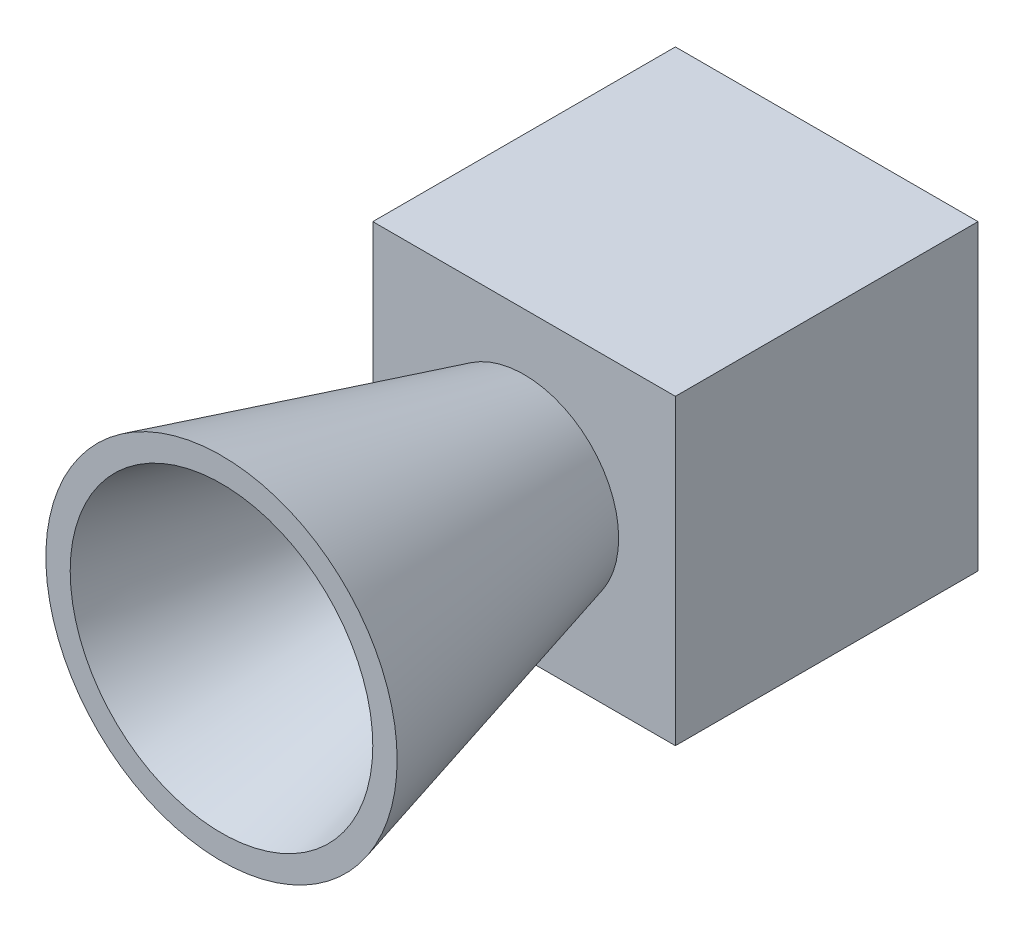
ISO-10303-21;
HEADER;
FILE_DESCRIPTION(('STEP AP214'),'2;1');
FILE_NAME('part.step','',(''),(''),'','','');
FILE_SCHEMA(('AUTOMOTIVE_DESIGN { 1 0 10303 214 1 1 1 1 }'));
ENDSEC;
DATA;
#1=APPLICATION_CONTEXT('core data for automotive mechanical design processes');
#2=APPLICATION_PROTOCOL_DEFINITION('international standard','automotive_design',2000,#1);
#3=PRODUCT_CONTEXT('',#1,'mechanical');
#4=PRODUCT('Part','Part','',(#3));
#5=PRODUCT_RELATED_PRODUCT_CATEGORY('part','',(#4));
#6=PRODUCT_DEFINITION_FORMATION('','',#4);
#7=PRODUCT_DEFINITION_CONTEXT('part definition',#1,'design');
#8=PRODUCT_DEFINITION('design','',#6,#7);
#9=PRODUCT_DEFINITION_SHAPE('','',#8);
#10=(LENGTH_UNIT() NAMED_UNIT(*) SI_UNIT(.MILLI.,.METRE.));
#11=(NAMED_UNIT(*) PLANE_ANGLE_UNIT() SI_UNIT($,.RADIAN.));
#12=(NAMED_UNIT(*) SI_UNIT($,.STERADIAN.) SOLID_ANGLE_UNIT());
#13=UNCERTAINTY_MEASURE_WITH_UNIT(LENGTH_MEASURE(1.E-05),#10,'distance_accuracy_value','');
#14=(GEOMETRIC_REPRESENTATION_CONTEXT(3) GLOBAL_UNCERTAINTY_ASSIGNED_CONTEXT((#13)) GLOBAL_UNIT_ASSIGNED_CONTEXT((#10,
#11,#12)) REPRESENTATION_CONTEXT('',''));
#15=CARTESIAN_POINT('',(0.,0.,0.));
#16=DIRECTION('',(0.,0.,1.));
#17=DIRECTION('',(1.,0.,0.));
#18=AXIS2_PLACEMENT_3D('',#15,#16,#17);
#19=CARTESIAN_POINT('',(0.,0.,1219.2));
#20=DIRECTION('',(0.,0.,1.));
#21=DIRECTION('',(1.,0.,0.));
#22=AXIS2_PLACEMENT_3D('',#19,#20,#21);
#23=PLANE('',#22);
#24=DIRECTION('',(0.,-1.,0.));
#25=VECTOR('',#24,1.);
#26=CARTESIAN_POINT('',(-609.6,-609.6,1219.2));
#27=LINE('',#26,#25);
#28=CARTESIAN_POINT('',(-609.6,609.6,1219.2));
#29=VERTEX_POINT('',#28);
#30=CARTESIAN_POINT('',(-609.6,-609.6,1219.2));
#31=VERTEX_POINT('',#30);
#32=EDGE_CURVE('E168',#29,#31,#27,.T.);
#33=ORIENTED_EDGE('',*,*,#32,.T.);
#34=DIRECTION('',(1.,0.,0.));
#35=VECTOR('',#34,1.);
#36=CARTESIAN_POINT('',(609.6,-609.6,1219.2));
#37=LINE('',#36,#35);
#38=CARTESIAN_POINT('',(609.6,-609.6,1219.2));
#39=VERTEX_POINT('',#38);
#40=EDGE_CURVE('E86',#31,#39,#37,.T.);
#41=ORIENTED_EDGE('',*,*,#40,.T.);
#42=DIRECTION('',(0.,1.,0.));
#43=VECTOR('',#42,1.);
#44=CARTESIAN_POINT('',(609.6,-609.6,1219.2));
#45=LINE('',#44,#43);
#46=CARTESIAN_POINT('',(609.6,609.6,1219.2));
#47=VERTEX_POINT('',#46);
#48=EDGE_CURVE('E171',#39,#47,#45,.T.);
#49=ORIENTED_EDGE('',*,*,#48,.T.);
#50=DIRECTION('',(-1.,0.,0.));
#51=VECTOR('',#50,1.);
#52=CARTESIAN_POINT('',(609.6,609.6,1219.2));
#53=LINE('',#52,#51);
#54=EDGE_CURVE('E55',#47,#29,#53,.T.);
#55=ORIENTED_EDGE('',*,*,#54,.T.);
#56=EDGE_LOOP('',(#33,#41,#49,#55));
#57=FACE_BOUND('',#56,.T.);
#58=CARTESIAN_POINT('',(0.,0.,1219.2));
#59=DIRECTION('',(0.,0.,1.));
#60=DIRECTION('',(1.,0.,0.));
#61=AXIS2_PLACEMENT_3D('',#58,#59,#60);
#62=CIRCLE('',#61,381.);
#63=CARTESIAN_POINT('',(381.,0.,1219.2));
#64=VERTEX_POINT('',#63);
#65=EDGE_CURVE('E161',#64,#64,#62,.T.);
#66=ORIENTED_EDGE('',*,*,#65,.F.);
#67=EDGE_LOOP('',(#66));
#68=FACE_BOUND('',#67,.T.);
#69=ADVANCED_FACE('F38',(#57,#68),#23,.T.);
#70=CARTESIAN_POINT('',(-609.6,-609.6,1219.2));
#71=DIRECTION('',(1.,0.,0.));
#72=DIRECTION('',(0.,0.,-1.));
#73=AXIS2_PLACEMENT_3D('',#70,#71,#72);
#74=PLANE('',#73);
#75=DIRECTION('',(0.,-1.,0.));
#76=VECTOR('',#75,1.);
#77=CARTESIAN_POINT('',(-609.6,-609.6,0.));
#78=LINE('',#77,#76);
#79=CARTESIAN_POINT('',(-609.6,609.6,0.));
#80=VERTEX_POINT('',#79);
#81=CARTESIAN_POINT('',(-609.6,-609.6,0.));
#82=VERTEX_POINT('',#81);
#83=EDGE_CURVE('E167',#80,#82,#78,.T.);
#84=ORIENTED_EDGE('',*,*,#83,.T.);
#85=DIRECTION('',(0.,0.,-1.));
#86=VECTOR('',#85,1.);
#87=CARTESIAN_POINT('',(-609.6,-609.6,1219.2));
#88=LINE('',#87,#86);
#89=EDGE_CURVE('E11',#31,#82,#88,.T.);
#90=ORIENTED_EDGE('',*,*,#89,.F.);
#91=ORIENTED_EDGE('',*,*,#32,.F.);
#92=DIRECTION('',(0.,0.,-1.));
#93=VECTOR('',#92,1.);
#94=CARTESIAN_POINT('',(-609.6,609.6,1219.2));
#95=LINE('',#94,#93);
#96=EDGE_CURVE('E174',#29,#80,#95,.T.);
#97=ORIENTED_EDGE('',*,*,#96,.T.);
#98=EDGE_LOOP('',(#84,#90,#91,#97));
#99=FACE_BOUND('',#98,.T.);
#100=ADVANCED_FACE('F40',(#99),#74,.F.);
#101=CARTESIAN_POINT('',(609.6,-609.6,1219.2));
#102=DIRECTION('',(0.,1.,0.));
#103=DIRECTION('',(-1.,0.,0.));
#104=AXIS2_PLACEMENT_3D('',#101,#102,#103);
#105=PLANE('',#104);
#106=DIRECTION('',(1.,0.,0.));
#107=VECTOR('',#106,1.);
#108=CARTESIAN_POINT('',(609.6,-609.6,0.));
#109=LINE('',#108,#107);
#110=CARTESIAN_POINT('',(609.6,-609.6,0.));
#111=VERTEX_POINT('',#110);
#112=EDGE_CURVE('E177',#82,#111,#109,.T.);
#113=ORIENTED_EDGE('',*,*,#112,.T.);
#114=DIRECTION('',(0.,0.,-1.));
#115=VECTOR('',#114,1.);
#116=CARTESIAN_POINT('',(609.6,-609.6,1219.2));
#117=LINE('',#116,#115);
#118=EDGE_CURVE('E47',#39,#111,#117,.T.);
#119=ORIENTED_EDGE('',*,*,#118,.F.);
#120=ORIENTED_EDGE('',*,*,#40,.F.);
#121=ORIENTED_EDGE('',*,*,#89,.T.);
#122=EDGE_LOOP('',(#113,#119,#120,#121));
#123=FACE_BOUND('',#122,.T.);
#124=ADVANCED_FACE('F200',(#123),#105,.F.);
#125=CARTESIAN_POINT('',(609.6,-609.6,1219.2));
#126=DIRECTION('',(-1.,0.,0.));
#127=DIRECTION('',(0.,0.,1.));
#128=AXIS2_PLACEMENT_3D('',#125,#126,#127);
#129=PLANE('',#128);
#130=DIRECTION('',(0.,1.,0.));
#131=VECTOR('',#130,1.);
#132=CARTESIAN_POINT('',(609.6,-609.6,0.));
#133=LINE('',#132,#131);
#134=CARTESIAN_POINT('',(609.6,609.6,0.));
#135=VERTEX_POINT('',#134);
#136=EDGE_CURVE('E73',#111,#135,#133,.T.);
#137=ORIENTED_EDGE('',*,*,#136,.T.);
#138=DIRECTION('',(0.,0.,-1.));
#139=VECTOR('',#138,1.);
#140=CARTESIAN_POINT('',(609.6,609.6,1219.2));
#141=LINE('',#140,#139);
#142=EDGE_CURVE('E182',#47,#135,#141,.T.);
#143=ORIENTED_EDGE('',*,*,#142,.F.);
#144=ORIENTED_EDGE('',*,*,#48,.F.);
#145=ORIENTED_EDGE('',*,*,#118,.T.);
#146=EDGE_LOOP('',(#137,#143,#144,#145));
#147=FACE_BOUND('',#146,.T.);
#148=ADVANCED_FACE('F184',(#147),#129,.F.);
#149=CARTESIAN_POINT('',(609.6,609.6,1219.2));
#150=DIRECTION('',(0.,-1.,0.));
#151=DIRECTION('',(1.,0.,0.));
#152=AXIS2_PLACEMENT_3D('',#149,#150,#151);
#153=PLANE('',#152);
#154=DIRECTION('',(-1.,0.,0.));
#155=VECTOR('',#154,1.);
#156=CARTESIAN_POINT('',(609.6,609.6,0.));
#157=LINE('',#156,#155);
#158=EDGE_CURVE('E79',#135,#80,#157,.T.);
#159=ORIENTED_EDGE('',*,*,#158,.T.);
#160=ORIENTED_EDGE('',*,*,#96,.F.);
#161=ORIENTED_EDGE('',*,*,#54,.F.);
#162=ORIENTED_EDGE('',*,*,#142,.T.);
#163=EDGE_LOOP('',(#159,#160,#161,#162));
#164=FACE_BOUND('',#163,.T.);
#165=ADVANCED_FACE('F191',(#164),#153,.F.);
#166=CARTESIAN_POINT('',(0.,0.,0.));
#167=DIRECTION('',(0.,0.,1.));
#168=DIRECTION('',(1.,0.,0.));
#169=AXIS2_PLACEMENT_3D('',#166,#167,#168);
#170=PLANE('',#169);
#171=ORIENTED_EDGE('',*,*,#83,.F.);
#172=ORIENTED_EDGE('',*,*,#158,.F.);
#173=ORIENTED_EDGE('',*,*,#136,.F.);
#174=ORIENTED_EDGE('',*,*,#112,.F.);
#175=EDGE_LOOP('',(#171,#172,#173,#174));
#176=FACE_BOUND('',#175,.T.);
#177=ADVANCED_FACE('F187',(#176),#170,.F.);
#178=CARTESIAN_POINT('',(0.,0.,1219.2));
#179=DIRECTION('',(0.,0.,1.));
#180=DIRECTION('',(1.,0.,0.));
#181=AXIS2_PLACEMENT_3D('',#178,#179,#180);
#182=CONICAL_SURFACE('',#181,381.,0.26179938779915);
#183=CARTESIAN_POINT('',(0.,0.,2438.4));
#184=DIRECTION('',(0.,0.,1.));
#185=DIRECTION('',(1.,0.,0.));
#186=AXIS2_PLACEMENT_3D('',#183,#184,#185);
#187=CIRCLE('',#186,707.683655412025);
#188=CARTESIAN_POINT('',(707.683655412025,0.,2438.4));
#189=VERTEX_POINT('',#188);
#190=EDGE_CURVE('E164',#189,#189,#187,.T.);
#191=ORIENTED_EDGE('',*,*,#190,.F.);
#192=EDGE_LOOP('',(#191));
#193=FACE_BOUND('',#192,.T.);
#194=ORIENTED_EDGE('',*,*,#65,.T.);
#195=EDGE_LOOP('',(#194));
#196=FACE_BOUND('',#195,.T.);
#197=ADVANCED_FACE('F198',(#193,#196),#182,.T.);
#198=CARTESIAN_POINT('',(0.,0.,2438.4));
#199=DIRECTION('',(0.,0.,1.));
#200=DIRECTION('',(1.,0.,0.));
#201=AXIS2_PLACEMENT_3D('',#198,#199,#200);
#202=PLANE('',#201);
#203=CARTESIAN_POINT('',(0.,0.,2438.4));
#204=DIRECTION('',(0.,0.,1.));
#205=DIRECTION('',(1.,0.,0.));
#206=AXIS2_PLACEMENT_3D('',#203,#204,#205);
#207=CIRCLE('',#206,609.6);
#208=CARTESIAN_POINT('',(609.6,0.,2438.4));
#209=VERTEX_POINT('',#208);
#210=EDGE_CURVE('E152',#209,#209,#207,.T.);
#211=ORIENTED_EDGE('',*,*,#210,.F.);
#212=EDGE_LOOP('',(#211));
#213=FACE_BOUND('',#212,.T.);
#214=ORIENTED_EDGE('',*,*,#190,.T.);
#215=EDGE_LOOP('',(#214));
#216=FACE_BOUND('',#215,.T.);
#217=ADVANCED_FACE('F211',(#213,#216),#202,.T.);
#218=CARTESIAN_POINT('',(0.,0.,2438.4));
#219=DIRECTION('',(0.,0.,1.));
#220=DIRECTION('',(1.,0.,0.));
#221=AXIS2_PLACEMENT_3D('',#218,#219,#220);
#222=CONICAL_SURFACE('',#221,609.6,0.26179938779915);
#223=CARTESIAN_POINT('',(0.,0.,1219.2));
#224=DIRECTION('',(0.,0.,1.));
#225=DIRECTION('',(1.,0.,0.));
#226=AXIS2_PLACEMENT_3D('',#223,#224,#225);
#227=CIRCLE('',#226,282.916344587975);
#228=CARTESIAN_POINT('',(282.916344587975,0.,1219.2));
#229=VERTEX_POINT('',#228);
#230=EDGE_CURVE('E158',#229,#229,#227,.T.);
#231=ORIENTED_EDGE('',*,*,#230,.F.);
#232=EDGE_LOOP('',(#231));
#233=FACE_BOUND('',#232,.T.);
#234=ORIENTED_EDGE('',*,*,#210,.T.);
#235=EDGE_LOOP('',(#234));
#236=FACE_BOUND('',#235,.T.);
#237=ADVANCED_FACE('F215',(#233,#236),#222,.F.);
#238=CARTESIAN_POINT('',(0.,0.,1219.2));
#239=DIRECTION('',(0.,0.,1.));
#240=DIRECTION('',(1.,0.,0.));
#241=AXIS2_PLACEMENT_3D('',#238,#239,#240);
#242=PLANE('',#241);
#243=ORIENTED_EDGE('',*,*,#230,.T.);
#244=EDGE_LOOP('',(#243));
#245=FACE_BOUND('',#244,.T.);
#246=ADVANCED_FACE('F219',(#245),#242,.T.);
#247=CLOSED_SHELL('',(#69,#100,#124,#148,#165,#177,#197,#217,#237,#246));
#248=CARTESIAN_POINT('',(533.4,-533.4,1104.9));
#249=DIRECTION('',(1.,0.,0.));
#250=DIRECTION('',(0.,0.,-1.));
#251=AXIS2_PLACEMENT_3D('',#248,#249,#250);
#252=PLANE('',#251);
#253=DIRECTION('',(0.,-1.,0.));
#254=VECTOR('',#253,1.);
#255=CARTESIAN_POINT('',(533.4,-533.4,38.1));
#256=LINE('',#255,#254);
#257=CARTESIAN_POINT('',(533.4,533.4,38.1));
#258=VERTEX_POINT('',#257);
#259=CARTESIAN_POINT('',(533.4,-533.4,38.1));
#260=VERTEX_POINT('',#259);
#261=EDGE_CURVE('E120',#258,#260,#256,.T.);
#262=ORIENTED_EDGE('',*,*,#261,.T.);
#263=DIRECTION('',(0.,0.,-1.));
#264=VECTOR('',#263,1.);
#265=CARTESIAN_POINT('',(533.4,-533.4,1104.9));
#266=LINE('',#265,#264);
#267=CARTESIAN_POINT('',(533.4,-533.4,1104.9));
#268=VERTEX_POINT('',#267);
#269=EDGE_CURVE('E113',#268,#260,#266,.T.);
#270=ORIENTED_EDGE('',*,*,#269,.F.);
#271=DIRECTION('',(0.,-1.,0.));
#272=VECTOR('',#271,1.);
#273=CARTESIAN_POINT('',(533.4,-533.4,1104.9));
#274=LINE('',#273,#272);
#275=CARTESIAN_POINT('',(533.4,533.4,1104.9));
#276=VERTEX_POINT('',#275);
#277=EDGE_CURVE('E117',#276,#268,#274,.T.);
#278=ORIENTED_EDGE('',*,*,#277,.F.);
#279=DIRECTION('',(0.,0.,-1.));
#280=VECTOR('',#279,1.);
#281=CARTESIAN_POINT('',(533.4,533.4,1104.9));
#282=LINE('',#281,#280);
#283=EDGE_CURVE('E150',#276,#258,#282,.T.);
#284=ORIENTED_EDGE('',*,*,#283,.T.);
#285=EDGE_LOOP('',(#262,#270,#278,#284));
#286=FACE_BOUND('',#285,.T.);
#287=ADVANCED_FACE('F115',(#286),#252,.F.);
#288=CARTESIAN_POINT('',(-533.4,533.4,1104.9));
#289=DIRECTION('',(0.,1.,0.));
#290=DIRECTION('',(-1.,0.,0.));
#291=AXIS2_PLACEMENT_3D('',#288,#289,#290);
#292=PLANE('',#291);
#293=DIRECTION('',(1.,0.,0.));
#294=VECTOR('',#293,1.);
#295=CARTESIAN_POINT('',(-533.4,533.4,38.1));
#296=LINE('',#295,#294);
#297=CARTESIAN_POINT('',(-533.4,533.4,38.1));
#298=VERTEX_POINT('',#297);
#299=EDGE_CURVE('E137',#298,#258,#296,.T.);
#300=ORIENTED_EDGE('',*,*,#299,.T.);
#301=ORIENTED_EDGE('',*,*,#283,.F.);
#302=DIRECTION('',(1.,0.,0.));
#303=VECTOR('',#302,1.);
#304=CARTESIAN_POINT('',(-533.4,533.4,1104.9));
#305=LINE('',#304,#303);
#306=CARTESIAN_POINT('',(-533.4,533.4,1104.9));
#307=VERTEX_POINT('',#306);
#308=EDGE_CURVE('E125',#307,#276,#305,.T.);
#309=ORIENTED_EDGE('',*,*,#308,.F.);
#310=DIRECTION('',(0.,0.,-1.));
#311=VECTOR('',#310,1.);
#312=CARTESIAN_POINT('',(-533.4,533.4,1104.9));
#313=LINE('',#312,#311);
#314=EDGE_CURVE('E153',#307,#298,#313,.T.);
#315=ORIENTED_EDGE('',*,*,#314,.T.);
#316=EDGE_LOOP('',(#300,#301,#309,#315));
#317=FACE_BOUND('',#316,.T.);
#318=ADVANCED_FACE('F226',(#317),#292,.F.);
#319=CARTESIAN_POINT('',(-533.4,-533.4,1104.9));
#320=DIRECTION('',(-1.,0.,0.));
#321=DIRECTION('',(0.,0.,1.));
#322=AXIS2_PLACEMENT_3D('',#319,#320,#321);
#323=PLANE('',#322);
#324=DIRECTION('',(0.,1.,0.));
#325=VECTOR('',#324,1.);
#326=CARTESIAN_POINT('',(-533.4,-533.4,38.1));
#327=LINE('',#326,#325);
#328=CARTESIAN_POINT('',(-533.4,-533.4,38.1));
#329=VERTEX_POINT('',#328);
#330=EDGE_CURVE('E140',#329,#298,#327,.T.);
#331=ORIENTED_EDGE('',*,*,#330,.T.);
#332=ORIENTED_EDGE('',*,*,#314,.F.);
#333=DIRECTION('',(0.,1.,0.));
#334=VECTOR('',#333,1.);
#335=CARTESIAN_POINT('',(-533.4,-533.4,1104.9));
#336=LINE('',#335,#334);
#337=CARTESIAN_POINT('',(-533.4,-533.4,1104.9));
#338=VERTEX_POINT('',#337);
#339=EDGE_CURVE('E133',#338,#307,#336,.T.);
#340=ORIENTED_EDGE('',*,*,#339,.F.);
#341=DIRECTION('',(0.,0.,-1.));
#342=VECTOR('',#341,1.);
#343=CARTESIAN_POINT('',(-533.4,-533.4,1104.9));
#344=LINE('',#343,#342);
#345=EDGE_CURVE('E124',#338,#329,#344,.T.);
#346=ORIENTED_EDGE('',*,*,#345,.T.);
#347=EDGE_LOOP('',(#331,#332,#340,#346));
#348=FACE_BOUND('',#347,.T.);
#349=ADVANCED_FACE('F230',(#348),#323,.F.);
#350=CARTESIAN_POINT('',(-533.4,-533.4,1104.9));
#351=DIRECTION('',(0.,-1.,0.));
#352=DIRECTION('',(1.,0.,0.));
#353=AXIS2_PLACEMENT_3D('',#350,#351,#352);
#354=PLANE('',#353);
#355=DIRECTION('',(-1.,0.,0.));
#356=VECTOR('',#355,1.);
#357=CARTESIAN_POINT('',(-533.4,-533.4,38.1));
#358=LINE('',#357,#356);
#359=EDGE_CURVE('E146',#260,#329,#358,.T.);
#360=ORIENTED_EDGE('',*,*,#359,.T.);
#361=ORIENTED_EDGE('',*,*,#345,.F.);
#362=DIRECTION('',(-1.,0.,0.));
#363=VECTOR('',#362,1.);
#364=CARTESIAN_POINT('',(-533.4,-533.4,1104.9));
#365=LINE('',#364,#363);
#366=EDGE_CURVE('E128',#268,#338,#365,.T.);
#367=ORIENTED_EDGE('',*,*,#366,.F.);
#368=ORIENTED_EDGE('',*,*,#269,.T.);
#369=EDGE_LOOP('',(#360,#361,#367,#368));
#370=FACE_BOUND('',#369,.T.);
#371=ADVANCED_FACE('F129',(#370),#354,.F.);
#372=CARTESIAN_POINT('',(0.,0.,1104.9));
#373=DIRECTION('',(0.,0.,-1.));
#374=DIRECTION('',(-1.,0.,0.));
#375=AXIS2_PLACEMENT_3D('',#372,#373,#374);
#376=PLANE('',#375);
#377=ORIENTED_EDGE('',*,*,#277,.T.);
#378=ORIENTED_EDGE('',*,*,#366,.T.);
#379=ORIENTED_EDGE('',*,*,#339,.T.);
#380=ORIENTED_EDGE('',*,*,#308,.T.);
#381=EDGE_LOOP('',(#377,#378,#379,#380));
#382=FACE_BOUND('',#381,.T.);
#383=ADVANCED_FACE('F135',(#382),#376,.T.);
#384=CARTESIAN_POINT('',(0.,0.,38.1));
#385=DIRECTION('',(0.,0.,-1.));
#386=DIRECTION('',(-1.,0.,0.));
#387=AXIS2_PLACEMENT_3D('',#384,#385,#386);
#388=PLANE('',#387);
#389=ORIENTED_EDGE('',*,*,#261,.F.);
#390=ORIENTED_EDGE('',*,*,#299,.F.);
#391=ORIENTED_EDGE('',*,*,#330,.F.);
#392=ORIENTED_EDGE('',*,*,#359,.F.);
#393=EDGE_LOOP('',(#389,#390,#391,#392));
#394=FACE_BOUND('',#393,.T.);
#395=ADVANCED_FACE('F237',(#394),#388,.F.);
#396=CLOSED_SHELL('',(#287,#318,#349,#371,#383,#395));
#397=ORIENTED_CLOSED_SHELL('',*,#396,.T.);
#398=BREP_WITH_VOIDS('B2',#247,(#397));
#399=ADVANCED_BREP_SHAPE_REPRESENTATION('',(#18,#398),#14);
#400=SHAPE_DEFINITION_REPRESENTATION(#9,#399);
ENDSEC;
END-ISO-10303-21;
